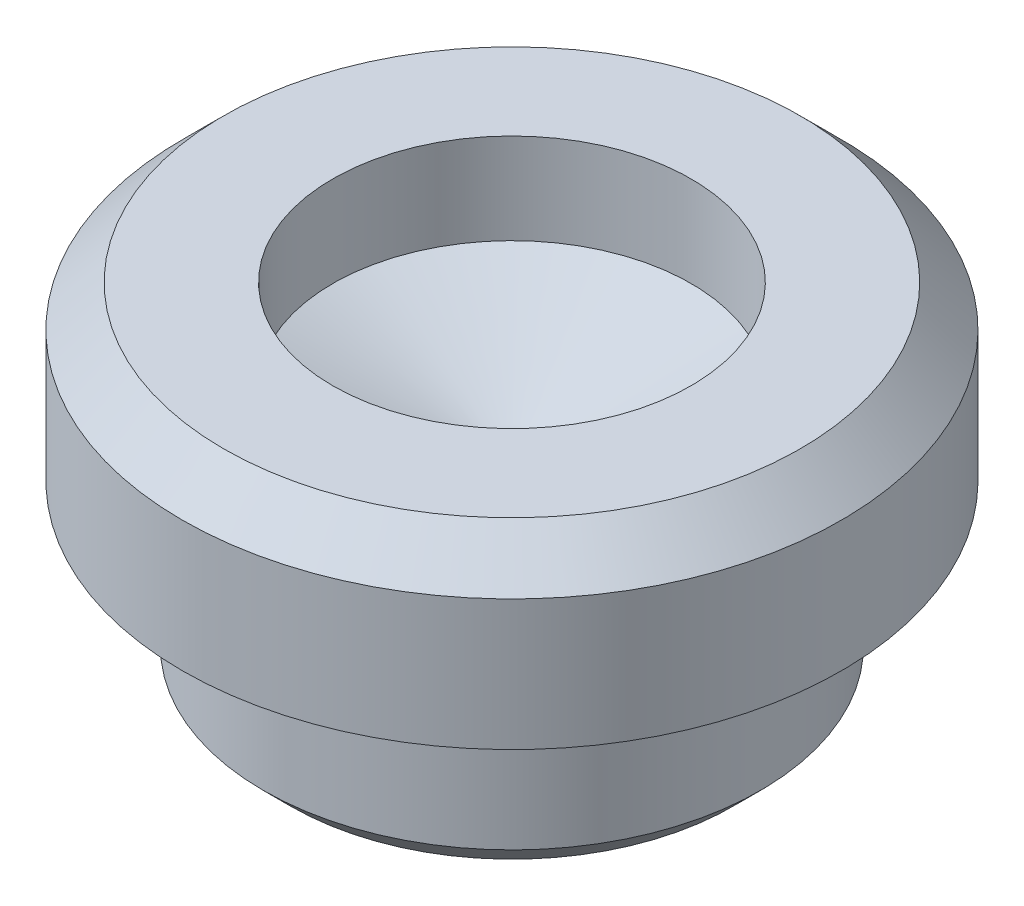
ISO-10303-21;
HEADER;
FILE_DESCRIPTION(('STEP AP214'),'2;1');
FILE_NAME('part.step','',(''),(''),'','','');
FILE_SCHEMA(('AUTOMOTIVE_DESIGN { 1 0 10303 214 1 1 1 1 }'));
ENDSEC;
DATA;
#1=APPLICATION_CONTEXT('core data for automotive mechanical design processes');
#2=APPLICATION_PROTOCOL_DEFINITION('international standard','automotive_design',2000,#1);
#3=PRODUCT_CONTEXT('',#1,'mechanical');
#4=PRODUCT('Part','Part','',(#3));
#5=PRODUCT_RELATED_PRODUCT_CATEGORY('part','',(#4));
#6=PRODUCT_DEFINITION_FORMATION('','',#4);
#7=PRODUCT_DEFINITION_CONTEXT('part definition',#1,'design');
#8=PRODUCT_DEFINITION('design','',#6,#7);
#9=PRODUCT_DEFINITION_SHAPE('','',#8);
#10=(LENGTH_UNIT() NAMED_UNIT(*) SI_UNIT(.MILLI.,.METRE.));
#11=(NAMED_UNIT(*) PLANE_ANGLE_UNIT() SI_UNIT($,.RADIAN.));
#12=(NAMED_UNIT(*) SI_UNIT($,.STERADIAN.) SOLID_ANGLE_UNIT());
#13=UNCERTAINTY_MEASURE_WITH_UNIT(LENGTH_MEASURE(1.E-05),#10,'distance_accuracy_value','');
#14=(GEOMETRIC_REPRESENTATION_CONTEXT(3) GLOBAL_UNCERTAINTY_ASSIGNED_CONTEXT((#13)) GLOBAL_UNIT_ASSIGNED_CONTEXT((#10,
#11,#12)) REPRESENTATION_CONTEXT('',''));
#15=CARTESIAN_POINT('',(0.,0.,0.));
#16=DIRECTION('',(0.,0.,1.));
#17=DIRECTION('',(1.,0.,0.));
#18=AXIS2_PLACEMENT_3D('',#15,#16,#17);
#19=CARTESIAN_POINT('',(0.,3.175,0.));
#20=DIRECTION('',(0.,-1.,0.));
#21=DIRECTION('',(0.,0.,-1.));
#22=AXIS2_PLACEMENT_3D('',#19,#20,#21);
#23=CYLINDRICAL_SURFACE('',#22,4.5974);
#24=CARTESIAN_POINT('',(0.,0.508000000000002,0.));
#25=DIRECTION('',(0.,1.,0.));
#26=DIRECTION('',(0.,0.,1.));
#27=AXIS2_PLACEMENT_3D('',#24,#25,#26);
#28=CIRCLE('',#27,4.5974);
#29=CARTESIAN_POINT('',(0.,0.508000000000002,4.5974));
#30=VERTEX_POINT('',#29);
#31=EDGE_CURVE('E40',#30,#30,#28,.T.);
#32=ORIENTED_EDGE('',*,*,#31,.T.);
#33=EDGE_LOOP('',(#32));
#34=FACE_BOUND('',#33,.T.);
#35=CARTESIAN_POINT('',(0.,3.175,0.));
#36=DIRECTION('',(0.,1.,0.));
#37=DIRECTION('',(0.,0.,1.));
#38=AXIS2_PLACEMENT_3D('',#35,#36,#37);
#39=CIRCLE('',#38,4.5974);
#40=CARTESIAN_POINT('',(0.,3.175,4.5974));
#41=VERTEX_POINT('',#40);
#42=EDGE_CURVE('E60',#41,#41,#39,.T.);
#43=ORIENTED_EDGE('',*,*,#42,.F.);
#44=EDGE_LOOP('',(#43));
#45=FACE_BOUND('',#44,.T.);
#46=ADVANCED_FACE('F33',(#34,#45),#23,.T.);
#47=CARTESIAN_POINT('',(0.,0.,0.));
#48=DIRECTION('',(0.,1.,0.));
#49=DIRECTION('',(0.,0.,1.));
#50=AXIS2_PLACEMENT_3D('',#47,#48,#49);
#51=PLANE('',#50);
#52=CARTESIAN_POINT('',(0.,0.,0.));
#53=DIRECTION('',(0.,1.,0.));
#54=DIRECTION('',(0.,0.,1.));
#55=AXIS2_PLACEMENT_3D('',#52,#53,#54);
#56=CIRCLE('',#55,4.0894);
#57=CARTESIAN_POINT('',(0.,0.,4.0894));
#58=VERTEX_POINT('',#57);
#59=EDGE_CURVE('E11',#58,#58,#56,.F.);
#60=ORIENTED_EDGE('',*,*,#59,.T.);
#61=EDGE_LOOP('',(#60));
#62=FACE_BOUND('',#61,.T.);
#63=ADVANCED_FACE('F85',(#62),#51,.F.);
#64=CARTESIAN_POINT('',(0.,6.35,0.));
#65=DIRECTION('',(0.,-1.,0.));
#66=DIRECTION('',(0.,0.,-1.));
#67=AXIS2_PLACEMENT_3D('',#64,#65,#66);
#68=CYLINDRICAL_SURFACE('',#67,6.096);
#69=CARTESIAN_POINT('',(0.,5.588,0.));
#70=DIRECTION('',(0.,1.,0.));
#71=DIRECTION('',(0.,0.,1.));
#72=AXIS2_PLACEMENT_3D('',#69,#70,#71);
#73=CIRCLE('',#72,6.096);
#74=CARTESIAN_POINT('',(0.,5.588,6.096));
#75=VERTEX_POINT('',#74);
#76=EDGE_CURVE('E66',#75,#75,#73,.F.);
#77=ORIENTED_EDGE('',*,*,#76,.T.);
#78=EDGE_LOOP('',(#77));
#79=FACE_BOUND('',#78,.T.);
#80=CARTESIAN_POINT('',(0.,3.175,0.));
#81=DIRECTION('',(0.,1.,0.));
#82=DIRECTION('',(0.,0.,1.));
#83=AXIS2_PLACEMENT_3D('',#80,#81,#82);
#84=CIRCLE('',#83,6.096);
#85=CARTESIAN_POINT('',(0.,3.175,6.096));
#86=VERTEX_POINT('',#85);
#87=EDGE_CURVE('E55',#86,#86,#84,.T.);
#88=ORIENTED_EDGE('',*,*,#87,.T.);
#89=EDGE_LOOP('',(#88));
#90=FACE_BOUND('',#89,.T.);
#91=ADVANCED_FACE('F90',(#79,#90),#68,.T.);
#92=CARTESIAN_POINT('',(0.,6.35,0.));
#93=DIRECTION('',(0.,1.,0.));
#94=DIRECTION('',(0.,0.,1.));
#95=AXIS2_PLACEMENT_3D('',#92,#93,#94);
#96=PLANE('',#95);
#97=CARTESIAN_POINT('',(0.,6.35,0.));
#98=DIRECTION('',(0.,1.,0.));
#99=DIRECTION('',(0.,0.,1.));
#100=AXIS2_PLACEMENT_3D('',#97,#98,#99);
#101=CIRCLE('',#100,3.3147);
#102=CARTESIAN_POINT('',(0.,6.35,3.3147));
#103=VERTEX_POINT('',#102);
#104=EDGE_CURVE('E52',#103,#103,#101,.T.);
#105=ORIENTED_EDGE('',*,*,#104,.F.);
#106=EDGE_LOOP('',(#105));
#107=FACE_BOUND('',#106,.T.);
#108=CARTESIAN_POINT('',(0.,6.35,0.));
#109=DIRECTION('',(0.,1.,0.));
#110=DIRECTION('',(0.,0.,1.));
#111=AXIS2_PLACEMENT_3D('',#108,#109,#110);
#112=CIRCLE('',#111,5.334);
#113=CARTESIAN_POINT('',(0.,6.35,5.334));
#114=VERTEX_POINT('',#113);
#115=EDGE_CURVE('E63',#114,#114,#112,.T.);
#116=ORIENTED_EDGE('',*,*,#115,.T.);
#117=EDGE_LOOP('',(#116));
#118=FACE_BOUND('',#117,.T.);
#119=ADVANCED_FACE('F96',(#107,#118),#96,.T.);
#120=CARTESIAN_POINT('',(0.,3.175,0.));
#121=DIRECTION('',(0.,1.,0.));
#122=DIRECTION('',(0.,0.,1.));
#123=AXIS2_PLACEMENT_3D('',#120,#121,#122);
#124=PLANE('',#123);
#125=ORIENTED_EDGE('',*,*,#42,.T.);
#126=EDGE_LOOP('',(#125));
#127=FACE_BOUND('',#126,.T.);
#128=ORIENTED_EDGE('',*,*,#87,.F.);
#129=EDGE_LOOP('',(#128));
#130=FACE_BOUND('',#129,.T.);
#131=ADVANCED_FACE('F81',(#127,#130),#124,.F.);
#132=CARTESIAN_POINT('',(0.,6.35,0.));
#133=DIRECTION('',(0.,-1.,0.));
#134=DIRECTION('',(0.,0.,-1.));
#135=AXIS2_PLACEMENT_3D('',#132,#133,#134);
#136=CONICAL_SURFACE('',#135,5.334,0.785398163397448);
#137=ORIENTED_EDGE('',*,*,#76,.F.);
#138=EDGE_LOOP('',(#137));
#139=FACE_BOUND('',#138,.T.);
#140=ORIENTED_EDGE('',*,*,#115,.F.);
#141=EDGE_LOOP('',(#140));
#142=FACE_BOUND('',#141,.T.);
#143=ADVANCED_FACE('F74',(#139,#142),#136,.T.);
#144=CARTESIAN_POINT('',(0.,0.508000000000002,0.));
#145=DIRECTION('',(0.,1.,0.));
#146=DIRECTION('',(0.,0.,1.));
#147=AXIS2_PLACEMENT_3D('',#144,#145,#146);
#148=CONICAL_SURFACE('',#147,4.5974,0.785398163397448);
#149=ORIENTED_EDGE('',*,*,#59,.F.);
#150=EDGE_LOOP('',(#149));
#151=FACE_BOUND('',#150,.T.);
#152=ORIENTED_EDGE('',*,*,#31,.F.);
#153=EDGE_LOOP('',(#152));
#154=FACE_BOUND('',#153,.T.);
#155=ADVANCED_FACE('F35',(#151,#154),#148,.T.);
#156=CARTESIAN_POINT('',(0.,4.6736,0.));
#157=DIRECTION('',(0.,1.,0.));
#158=DIRECTION('',(0.,0.,1.));
#159=AXIS2_PLACEMENT_3D('',#156,#157,#158);
#160=CYLINDRICAL_SURFACE('',#159,3.3147);
#161=CARTESIAN_POINT('',(0.,4.6736,0.));
#162=DIRECTION('',(0.,1.,0.));
#163=DIRECTION('',(0.,0.,1.));
#164=AXIS2_PLACEMENT_3D('',#161,#162,#163);
#165=CIRCLE('',#164,3.3147);
#166=CARTESIAN_POINT('',(0.,4.6736,3.3147));
#167=VERTEX_POINT('',#166);
#168=EDGE_CURVE('E50',#167,#167,#165,.T.);
#169=ORIENTED_EDGE('',*,*,#168,.F.);
#170=EDGE_LOOP('',(#169));
#171=FACE_BOUND('',#170,.T.);
#172=ORIENTED_EDGE('',*,*,#104,.T.);
#173=EDGE_LOOP('',(#172));
#174=FACE_BOUND('',#173,.T.);
#175=ADVANCED_FACE('F46',(#171,#174),#160,.F.);
#176=CARTESIAN_POINT('',(0.,4.6736,0.));
#177=DIRECTION('',(0.,1.,0.));
#178=DIRECTION('',(0.,0.,1.));
#179=AXIS2_PLACEMENT_3D('',#176,#177,#178);
#180=CONICAL_SURFACE('',#179,3.3147,1.18682389135615);
#181=CARTESIAN_POINT('',(0.,3.33437426922421,0.));
#182=VERTEX_POINT('',#181);
#183=VERTEX_LOOP('',#182);
#184=FACE_BOUND('',#183,.T.);
#185=ORIENTED_EDGE('',*,*,#168,.T.);
#186=EDGE_LOOP('',(#185));
#187=FACE_BOUND('',#186,.T.);
#188=ADVANCED_FACE('F43',(#184,#187),#180,.F.);
#189=CLOSED_SHELL('',(#46,#63,#91,#119,#131,#143,#155,#175,#188));
#190=MANIFOLD_SOLID_BREP('B2',#189);
#191=ADVANCED_BREP_SHAPE_REPRESENTATION('',(#18,#190),#14);
#192=SHAPE_DEFINITION_REPRESENTATION(#9,#191);
ENDSEC;
END-ISO-10303-21;
